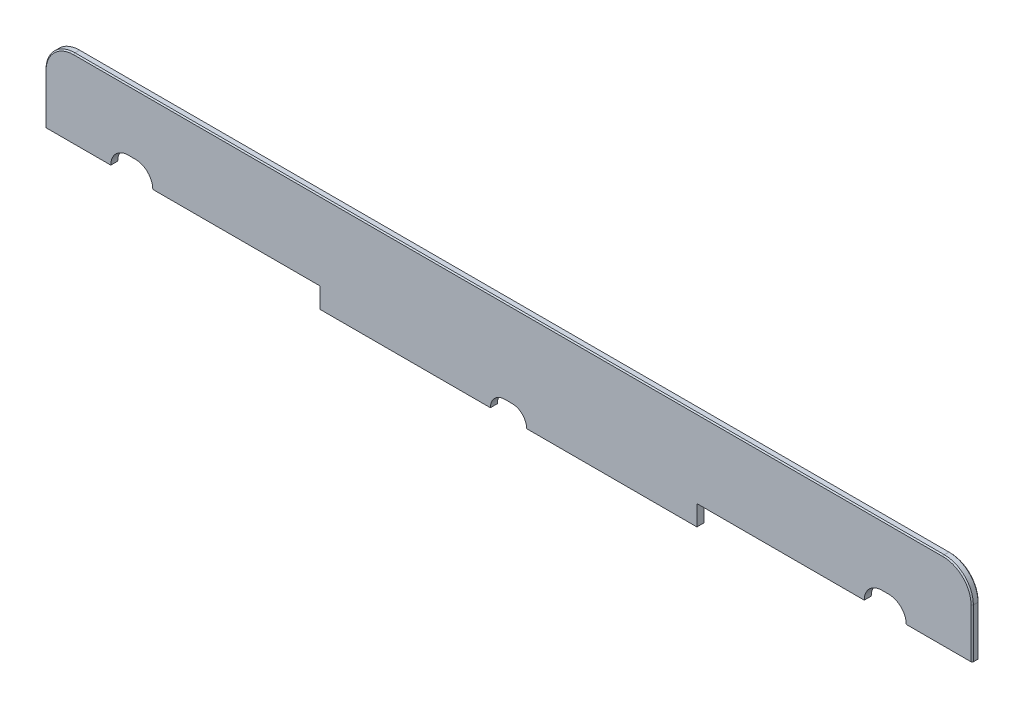
ISO-10303-21;
HEADER;
FILE_DESCRIPTION(('STEP AP214'),'2;1');
FILE_NAME('part.step','',(''),(''),'','','');
FILE_SCHEMA(('AUTOMOTIVE_DESIGN { 1 0 10303 214 1 1 1 1 }'));
ENDSEC;
DATA;
#1=APPLICATION_CONTEXT('core data for automotive mechanical design processes');
#2=APPLICATION_PROTOCOL_DEFINITION('international standard','automotive_design',2000,#1);
#3=PRODUCT_CONTEXT('',#1,'mechanical');
#4=PRODUCT('Part','Part','',(#3));
#5=PRODUCT_RELATED_PRODUCT_CATEGORY('part','',(#4));
#6=PRODUCT_DEFINITION_FORMATION('','',#4);
#7=PRODUCT_DEFINITION_CONTEXT('part definition',#1,'design');
#8=PRODUCT_DEFINITION('design','',#6,#7);
#9=PRODUCT_DEFINITION_SHAPE('','',#8);
#10=(LENGTH_UNIT() NAMED_UNIT(*) SI_UNIT(.MILLI.,.METRE.));
#11=(NAMED_UNIT(*) PLANE_ANGLE_UNIT() SI_UNIT($,.RADIAN.));
#12=(NAMED_UNIT(*) SI_UNIT($,.STERADIAN.) SOLID_ANGLE_UNIT());
#13=UNCERTAINTY_MEASURE_WITH_UNIT(LENGTH_MEASURE(1.E-05),#10,'distance_accuracy_value','');
#14=(GEOMETRIC_REPRESENTATION_CONTEXT(3) GLOBAL_UNCERTAINTY_ASSIGNED_CONTEXT((#13)) GLOBAL_UNIT_ASSIGNED_CONTEXT((#10,
#11,#12)) REPRESENTATION_CONTEXT('',''));
#15=CARTESIAN_POINT('',(0.,0.,0.));
#16=DIRECTION('',(0.,0.,1.));
#17=DIRECTION('',(1.,0.,0.));
#18=AXIS2_PLACEMENT_3D('',#15,#16,#17);
#19=CARTESIAN_POINT('',(-160.,0.,-0.01));
#20=DIRECTION('',(0.,-1.,0.));
#21=DIRECTION('',(0.,0.,-1.));
#22=AXIS2_PLACEMENT_3D('',#19,#20,#21);
#23=PLANE('',#22);
#24=DIRECTION('',(-1.,0.,0.));
#25=VECTOR('',#24,1.);
#26=CARTESIAN_POINT('',(0.,0.,0.));
#27=LINE('',#26,#25);
#28=CARTESIAN_POINT('',(-65.,0.,0.));
#29=VERTEX_POINT('',#28);
#30=CARTESIAN_POINT('',(-122.75,0.,0.));
#31=VERTEX_POINT('',#30);
#32=EDGE_CURVE('E244',#29,#31,#27,.T.);
#33=ORIENTED_EDGE('',*,*,#32,.F.);
#34=DIRECTION('',(0.,0.,1.));
#35=VECTOR('',#34,1.);
#36=CARTESIAN_POINT('',(-65.,0.,-0.01));
#37=LINE('',#36,#35);
#38=CARTESIAN_POINT('',(-65.,0.,2.4));
#39=VERTEX_POINT('',#38);
#40=EDGE_CURVE('E238',#29,#39,#37,.T.);
#41=ORIENTED_EDGE('',*,*,#40,.T.);
#42=DIRECTION('',(-1.,0.,0.));
#43=VECTOR('',#42,1.);
#44=CARTESIAN_POINT('',(0.,0.,2.4));
#45=LINE('',#44,#43);
#46=CARTESIAN_POINT('',(-122.75,0.,2.4));
#47=VERTEX_POINT('',#46);
#48=EDGE_CURVE('E241',#39,#47,#45,.T.);
#49=ORIENTED_EDGE('',*,*,#48,.T.);
#50=DIRECTION('',(0.,0.,-1.));
#51=VECTOR('',#50,1.);
#52=CARTESIAN_POINT('',(-122.75,0.,2.4));
#53=LINE('',#52,#51);
#54=EDGE_CURVE('E385',#31,#47,#53,.F.);
#55=ORIENTED_EDGE('',*,*,#54,.F.);
#56=EDGE_LOOP('',(#33,#41,#49,#55));
#57=FACE_BOUND('',#56,.T.);
#58=ADVANCED_FACE('F41',(#57),#23,.T.);
#59=CARTESIAN_POINT('',(-65.,-7.00000000000001,-0.01));
#60=DIRECTION('',(0.,-1.,0.));
#61=DIRECTION('',(1.,0.,0.));
#62=AXIS2_PLACEMENT_3D('',#59,#60,#61);
#63=PLANE('',#62);
#64=DIRECTION('',(-1.,0.,0.));
#65=VECTOR('',#64,1.);
#66=CARTESIAN_POINT('',(0.,-7.,0.));
#67=LINE('',#66,#65);
#68=CARTESIAN_POINT('',(-6.25,-7.,0.));
#69=VERTEX_POINT('',#68);
#70=CARTESIAN_POINT('',(-65.,-7.00000000000001,0.));
#71=VERTEX_POINT('',#70);
#72=EDGE_CURVE('E399',#69,#71,#67,.T.);
#73=ORIENTED_EDGE('',*,*,#72,.F.);
#74=DIRECTION('',(0.,0.,-1.));
#75=VECTOR('',#74,1.);
#76=CARTESIAN_POINT('',(-6.25,-7.,2.4));
#77=LINE('',#76,#75);
#78=CARTESIAN_POINT('',(-6.25,-7.,2.4));
#79=VERTEX_POINT('',#78);
#80=EDGE_CURVE('E377',#79,#69,#77,.T.);
#81=ORIENTED_EDGE('',*,*,#80,.F.);
#82=DIRECTION('',(-1.,0.,0.));
#83=VECTOR('',#82,1.);
#84=CARTESIAN_POINT('',(0.,-7.,2.4));
#85=LINE('',#84,#83);
#86=CARTESIAN_POINT('',(-65.,-7.00000000000001,2.4));
#87=VERTEX_POINT('',#86);
#88=EDGE_CURVE('E257',#79,#87,#85,.T.);
#89=ORIENTED_EDGE('',*,*,#88,.T.);
#90=DIRECTION('',(0.,0.,1.));
#91=VECTOR('',#90,1.);
#92=CARTESIAN_POINT('',(-65.,-7.00000000000001,-0.01));
#93=LINE('',#92,#91);
#94=EDGE_CURVE('E248',#71,#87,#93,.T.);
#95=ORIENTED_EDGE('',*,*,#94,.F.);
#96=EDGE_LOOP('',(#73,#81,#89,#95));
#97=FACE_BOUND('',#96,.T.);
#98=ADVANCED_FACE('F487',(#97),#63,.T.);
#99=CARTESIAN_POINT('',(-65.,0.,-0.01));
#100=DIRECTION('',(-1.,0.,0.));
#101=DIRECTION('',(0.,0.,1.));
#102=AXIS2_PLACEMENT_3D('',#99,#100,#101);
#103=PLANE('',#102);
#104=DIRECTION('',(0.,1.,0.));
#105=VECTOR('',#104,1.);
#106=CARTESIAN_POINT('',(-65.,0.,0.));
#107=LINE('',#106,#105);
#108=EDGE_CURVE('E401',#71,#29,#107,.T.);
#109=ORIENTED_EDGE('',*,*,#108,.F.);
#110=ORIENTED_EDGE('',*,*,#94,.T.);
#111=DIRECTION('',(0.,1.,0.));
#112=VECTOR('',#111,1.);
#113=CARTESIAN_POINT('',(-65.,0.,2.4));
#114=LINE('',#113,#112);
#115=EDGE_CURVE('E252',#87,#39,#114,.T.);
#116=ORIENTED_EDGE('',*,*,#115,.T.);
#117=ORIENTED_EDGE('',*,*,#40,.F.);
#118=EDGE_LOOP('',(#109,#110,#116,#117));
#119=FACE_BOUND('',#118,.T.);
#120=ADVANCED_FACE('F253',(#119),#103,.T.);
#121=CARTESIAN_POINT('',(65.,0.,-0.01));
#122=DIRECTION('',(0.,-1.,0.));
#123=DIRECTION('',(1.,0.,0.));
#124=AXIS2_PLACEMENT_3D('',#121,#122,#123);
#125=PLANE('',#124);
#126=DIRECTION('',(-1.,0.,0.));
#127=VECTOR('',#126,1.);
#128=CARTESIAN_POINT('',(0.,0.,0.));
#129=LINE('',#128,#127);
#130=CARTESIAN_POINT('',(122.75,0.,0.));
#131=VERTEX_POINT('',#130);
#132=CARTESIAN_POINT('',(65.,0.,0.));
#133=VERTEX_POINT('',#132);
#134=EDGE_CURVE('E395',#131,#133,#129,.T.);
#135=ORIENTED_EDGE('',*,*,#134,.F.);
#136=DIRECTION('',(0.,0.,-1.));
#137=VECTOR('',#136,1.);
#138=CARTESIAN_POINT('',(122.75,0.,2.4));
#139=LINE('',#138,#137);
#140=CARTESIAN_POINT('',(122.75,0.,2.4));
#141=VERTEX_POINT('',#140);
#142=EDGE_CURVE('E379',#141,#131,#139,.T.);
#143=ORIENTED_EDGE('',*,*,#142,.F.);
#144=DIRECTION('',(-1.,0.,0.));
#145=VECTOR('',#144,1.);
#146=CARTESIAN_POINT('',(0.,0.,2.4));
#147=LINE('',#146,#145);
#148=CARTESIAN_POINT('',(65.,0.,2.4));
#149=VERTEX_POINT('',#148);
#150=EDGE_CURVE('E272',#141,#149,#147,.T.);
#151=ORIENTED_EDGE('',*,*,#150,.T.);
#152=DIRECTION('',(0.,0.,1.));
#153=VECTOR('',#152,1.);
#154=CARTESIAN_POINT('',(65.,0.,-0.01));
#155=LINE('',#154,#153);
#156=EDGE_CURVE('E11',#133,#149,#155,.T.);
#157=ORIENTED_EDGE('',*,*,#156,.F.);
#158=EDGE_LOOP('',(#135,#143,#151,#157));
#159=FACE_BOUND('',#158,.T.);
#160=ADVANCED_FACE('F523',(#159),#125,.T.);
#161=DIRECTION('',(-1.,0.,0.));
#162=VECTOR('',#161,1.);
#163=CARTESIAN_POINT('',(0.,-7.,0.));
#164=LINE('',#163,#162);
#165=CARTESIAN_POINT('',(65.,-6.99999999999999,0.));
#166=VERTEX_POINT('',#165);
#167=CARTESIAN_POINT('',(6.25,-7.,0.));
#168=VERTEX_POINT('',#167);
#169=EDGE_CURVE('E390',#166,#168,#164,.T.);
#170=ORIENTED_EDGE('',*,*,#169,.F.);
#171=DIRECTION('',(0.,0.,1.));
#172=VECTOR('',#171,1.);
#173=CARTESIAN_POINT('',(65.,-6.99999999999999,-0.01));
#174=LINE('',#173,#172);
#175=CARTESIAN_POINT('',(65.,-6.99999999999999,2.4));
#176=VERTEX_POINT('',#175);
#177=EDGE_CURVE('E52',#166,#176,#174,.T.);
#178=ORIENTED_EDGE('',*,*,#177,.T.);
#179=DIRECTION('',(-1.,0.,0.));
#180=VECTOR('',#179,1.);
#181=CARTESIAN_POINT('',(0.,-7.,2.4));
#182=LINE('',#181,#180);
#183=CARTESIAN_POINT('',(6.25,-7.,2.4));
#184=VERTEX_POINT('',#183);
#185=EDGE_CURVE('E278',#176,#184,#182,.T.);
#186=ORIENTED_EDGE('',*,*,#185,.T.);
#187=DIRECTION('',(0.,0.,-1.));
#188=VECTOR('',#187,1.);
#189=CARTESIAN_POINT('',(6.25,-7.,2.4));
#190=LINE('',#189,#188);
#191=EDGE_CURVE('E375',#168,#184,#190,.F.);
#192=ORIENTED_EDGE('',*,*,#191,.F.);
#193=EDGE_LOOP('',(#170,#178,#186,#192));
#194=FACE_BOUND('',#193,.T.);
#195=ADVANCED_FACE('F524',(#194),#63,.T.);
#196=CARTESIAN_POINT('',(65.,-6.99999999999999,-0.01));
#197=DIRECTION('',(1.,0.,0.));
#198=DIRECTION('',(0.,0.,-1.));
#199=AXIS2_PLACEMENT_3D('',#196,#197,#198);
#200=PLANE('',#199);
#201=DIRECTION('',(0.,-1.,0.));
#202=VECTOR('',#201,1.);
#203=CARTESIAN_POINT('',(65.,0.,0.));
#204=LINE('',#203,#202);
#205=EDGE_CURVE('E392',#133,#166,#204,.T.);
#206=ORIENTED_EDGE('',*,*,#205,.F.);
#207=ORIENTED_EDGE('',*,*,#156,.T.);
#208=DIRECTION('',(0.,-1.,0.));
#209=VECTOR('',#208,1.);
#210=CARTESIAN_POINT('',(65.,0.,2.4));
#211=LINE('',#210,#209);
#212=EDGE_CURVE('E275',#149,#176,#211,.T.);
#213=ORIENTED_EDGE('',*,*,#212,.T.);
#214=ORIENTED_EDGE('',*,*,#177,.F.);
#215=EDGE_LOOP('',(#206,#207,#213,#214));
#216=FACE_BOUND('',#215,.T.);
#217=ADVANCED_FACE('F544',(#216),#200,.T.);
#218=DIRECTION('',(-0.707106781186583,0.,-0.707106781186512));
#219=VECTOR('',#218,1.);
#220=CARTESIAN_POINT('',(-159.6,0.,2.4));
#221=LINE('',#220,#219);
#222=CARTESIAN_POINT('',(-160.,0.,2.00000000000007));
#223=VERTEX_POINT('',#222);
#224=CARTESIAN_POINT('',(-159.6,0.,2.4));
#225=VERTEX_POINT('',#224);
#226=EDGE_CURVE('E372',#223,#225,#221,.F.);
#227=ORIENTED_EDGE('',*,*,#226,.F.);
#228=DIRECTION('',(0.,0.,-1.));
#229=VECTOR('',#228,1.);
#230=CARTESIAN_POINT('',(-160.,0.,2.4));
#231=LINE('',#230,#229);
#232=CARTESIAN_POINT('',(-160.,0.,0.400000000000039));
#233=VERTEX_POINT('',#232);
#234=EDGE_CURVE('E284',#223,#233,#231,.T.);
#235=ORIENTED_EDGE('',*,*,#234,.T.);
#236=DIRECTION('',(-0.707106781186534,0.,0.707106781186561));
#237=VECTOR('',#236,1.);
#238=CARTESIAN_POINT('',(-160.,0.,0.400000000000033));
#239=LINE('',#238,#237);
#240=CARTESIAN_POINT('',(-159.6,0.,0.));
#241=VERTEX_POINT('',#240);
#242=EDGE_CURVE('E368',#241,#233,#239,.T.);
#243=ORIENTED_EDGE('',*,*,#242,.F.);
#244=CARTESIAN_POINT('',(-137.25,0.,0.));
#245=VERTEX_POINT('',#244);
#246=EDGE_CURVE('E268',#245,#241,#27,.T.);
#247=ORIENTED_EDGE('',*,*,#246,.F.);
#248=DIRECTION('',(0.,0.,-1.));
#249=VECTOR('',#248,1.);
#250=CARTESIAN_POINT('',(-137.25,0.,2.4));
#251=LINE('',#250,#249);
#252=CARTESIAN_POINT('',(-137.25,0.,2.4));
#253=VERTEX_POINT('',#252);
#254=EDGE_CURVE('E383',#253,#245,#251,.T.);
#255=ORIENTED_EDGE('',*,*,#254,.F.);
#256=EDGE_CURVE('E263',#253,#225,#45,.T.);
#257=ORIENTED_EDGE('',*,*,#256,.T.);
#258=EDGE_LOOP('',(#227,#235,#243,#247,#255,#257));
#259=FACE_BOUND('',#258,.T.);
#260=ADVANCED_FACE('F520',(#259),#23,.T.);
#261=DIRECTION('',(-0.707106781186561,0.,0.707106781186534));
#262=VECTOR('',#261,1.);
#263=CARTESIAN_POINT('',(159.6,0.,2.4));
#264=LINE('',#263,#262);
#265=CARTESIAN_POINT('',(159.6,0.,2.4));
#266=VERTEX_POINT('',#265);
#267=CARTESIAN_POINT('',(160.,0.,2.00000000000007));
#268=VERTEX_POINT('',#267);
#269=EDGE_CURVE('E370',#266,#268,#264,.F.);
#270=ORIENTED_EDGE('',*,*,#269,.F.);
#271=DIRECTION('',(-1.,0.,0.));
#272=VECTOR('',#271,1.);
#273=CARTESIAN_POINT('',(0.,0.,2.4));
#274=LINE('',#273,#272);
#275=CARTESIAN_POINT('',(137.25,0.,2.4));
#276=VERTEX_POINT('',#275);
#277=EDGE_CURVE('E281',#266,#276,#274,.T.);
#278=ORIENTED_EDGE('',*,*,#277,.T.);
#279=DIRECTION('',(0.,0.,-1.));
#280=VECTOR('',#279,1.);
#281=CARTESIAN_POINT('',(137.25,0.,2.4));
#282=LINE('',#281,#280);
#283=CARTESIAN_POINT('',(137.25,0.,0.));
#284=VERTEX_POINT('',#283);
#285=EDGE_CURVE('E381',#284,#276,#282,.F.);
#286=ORIENTED_EDGE('',*,*,#285,.F.);
#287=DIRECTION('',(-1.,0.,0.));
#288=VECTOR('',#287,1.);
#289=CARTESIAN_POINT('',(0.,0.,0.));
#290=LINE('',#289,#288);
#291=CARTESIAN_POINT('',(159.6,0.,0.));
#292=VERTEX_POINT('',#291);
#293=EDGE_CURVE('E387',#292,#284,#290,.T.);
#294=ORIENTED_EDGE('',*,*,#293,.F.);
#295=DIRECTION('',(-0.707106781186512,0.,-0.707106781186583));
#296=VECTOR('',#295,1.);
#297=CARTESIAN_POINT('',(160.,0.,0.400000000000043));
#298=LINE('',#297,#296);
#299=CARTESIAN_POINT('',(160.,0.,0.400000000000039));
#300=VERTEX_POINT('',#299);
#301=EDGE_CURVE('E294',#300,#292,#298,.T.);
#302=ORIENTED_EDGE('',*,*,#301,.F.);
#303=DIRECTION('',(0.,0.,1.));
#304=VECTOR('',#303,1.);
#305=CARTESIAN_POINT('',(160.,0.,2.4));
#306=LINE('',#305,#304);
#307=EDGE_CURVE('E287',#300,#268,#306,.T.);
#308=ORIENTED_EDGE('',*,*,#307,.T.);
#309=EDGE_LOOP('',(#270,#278,#286,#294,#302,#308));
#310=FACE_BOUND('',#309,.T.);
#311=ADVANCED_FACE('F509',(#310),#125,.T.);
#312=CARTESIAN_POINT('',(160.,27.,2.4));
#313=DIRECTION('',(0.,-1.,0.));
#314=DIRECTION('',(1.,0.,0.));
#315=AXIS2_PLACEMENT_3D('',#312,#313,#314);
#316=PLANE('',#315);
#317=DIRECTION('',(0.,0.,-1.));
#318=VECTOR('',#317,1.);
#319=CARTESIAN_POINT('',(-150.,27.,2.4));
#320=LINE('',#319,#318);
#321=CARTESIAN_POINT('',(-150.,27.,0.400000000000039));
#322=VERTEX_POINT('',#321);
#323=CARTESIAN_POINT('',(-150.,27.,2.00000000000007));
#324=VERTEX_POINT('',#323);
#325=EDGE_CURVE('E459',#322,#324,#320,.F.);
#326=ORIENTED_EDGE('',*,*,#325,.T.);
#327=DIRECTION('',(1.,0.,0.));
#328=VECTOR('',#327,1.);
#329=CARTESIAN_POINT('',(160.,27.,2.00000000000007));
#330=LINE('',#329,#328);
#331=CARTESIAN_POINT('',(150.,27.,2.00000000000007));
#332=VERTEX_POINT('',#331);
#333=EDGE_CURVE('E440',#324,#332,#330,.T.);
#334=ORIENTED_EDGE('',*,*,#333,.T.);
#335=DIRECTION('',(0.,0.,-1.));
#336=VECTOR('',#335,1.);
#337=CARTESIAN_POINT('',(150.,27.,2.4));
#338=LINE('',#337,#336);
#339=CARTESIAN_POINT('',(150.,27.,0.400000000000039));
#340=VERTEX_POINT('',#339);
#341=EDGE_CURVE('E456',#332,#340,#338,.T.);
#342=ORIENTED_EDGE('',*,*,#341,.T.);
#343=DIRECTION('',(-1.,0.,0.));
#344=VECTOR('',#343,1.);
#345=CARTESIAN_POINT('',(-150.,27.,0.400000000000039));
#346=LINE('',#345,#344);
#347=EDGE_CURVE('E442',#340,#322,#346,.T.);
#348=ORIENTED_EDGE('',*,*,#347,.T.);
#349=EDGE_LOOP('',(#326,#334,#342,#348));
#350=FACE_BOUND('',#349,.T.);
#351=ADVANCED_FACE('F506',(#350),#316,.F.);
#352=CARTESIAN_POINT('',(0.,26.6000000000001,2.4));
#353=DIRECTION('',(0.,-0.707106781186524,-0.707106781186571));
#354=DIRECTION('',(-1.,0.,0.));
#355=AXIS2_PLACEMENT_3D('',#352,#353,#354);
#356=PLANE('',#355);
#357=DIRECTION('',(0.,-0.707106781186566,0.707106781186529));
#358=VECTOR('',#357,1.);
#359=CARTESIAN_POINT('',(-150.,27.,2.00000000000007));
#360=LINE('',#359,#358);
#361=CARTESIAN_POINT('',(-150.,26.6000000000001,2.4));
#362=VERTEX_POINT('',#361);
#363=EDGE_CURVE('E425',#324,#362,#360,.T.);
#364=ORIENTED_EDGE('',*,*,#363,.T.);
#365=DIRECTION('',(-1.,0.,0.));
#366=VECTOR('',#365,1.);
#367=CARTESIAN_POINT('',(0.,26.6000000000001,2.4));
#368=LINE('',#367,#366);
#369=CARTESIAN_POINT('',(150.,26.6000000000001,2.4));
#370=VERTEX_POINT('',#369);
#371=EDGE_CURVE('E448',#370,#362,#368,.T.);
#372=ORIENTED_EDGE('',*,*,#371,.F.);
#373=DIRECTION('',(0.,-0.707106781186572,0.707106781186523));
#374=VECTOR('',#373,1.);
#375=CARTESIAN_POINT('',(150.,27.,2.00000000000007));
#376=LINE('',#375,#374);
#377=EDGE_CURVE('E428',#332,#370,#376,.T.);
#378=ORIENTED_EDGE('',*,*,#377,.F.);
#379=ORIENTED_EDGE('',*,*,#333,.F.);
#380=EDGE_LOOP('',(#364,#372,#378,#379));
#381=FACE_BOUND('',#380,.T.);
#382=ADVANCED_FACE('F508',(#381),#356,.F.);
#383=CARTESIAN_POINT('',(160.,27.,0.400000000000039));
#384=DIRECTION('',(0.,0.707106781186574,-0.707106781186521));
#385=DIRECTION('',(1.,0.,0.));
#386=AXIS2_PLACEMENT_3D('',#383,#384,#385);
#387=PLANE('',#386);
#388=DIRECTION('',(0.,0.707106781186514,0.707106781186581));
#389=VECTOR('',#388,1.);
#390=CARTESIAN_POINT('',(-150.,26.6,0.));
#391=LINE('',#390,#389);
#392=CARTESIAN_POINT('',(-150.,26.6,0.));
#393=VERTEX_POINT('',#392);
#394=EDGE_CURVE('E414',#393,#322,#391,.T.);
#395=ORIENTED_EDGE('',*,*,#394,.T.);
#396=ORIENTED_EDGE('',*,*,#347,.F.);
#397=DIRECTION('',(0.,0.70710678118652,0.707106781186575));
#398=VECTOR('',#397,1.);
#399=CARTESIAN_POINT('',(150.,26.6,0.));
#400=LINE('',#399,#398);
#401=CARTESIAN_POINT('',(150.,26.6,0.));
#402=VERTEX_POINT('',#401);
#403=EDGE_CURVE('E418',#402,#340,#400,.T.);
#404=ORIENTED_EDGE('',*,*,#403,.F.);
#405=DIRECTION('',(1.,0.,0.));
#406=VECTOR('',#405,1.);
#407=CARTESIAN_POINT('',(150.,26.6,0.));
#408=LINE('',#407,#406);
#409=EDGE_CURVE('E434',#393,#402,#408,.T.);
#410=ORIENTED_EDGE('',*,*,#409,.F.);
#411=EDGE_LOOP('',(#395,#396,#404,#410));
#412=FACE_BOUND('',#411,.T.);
#413=ADVANCED_FACE('F517',(#412),#387,.T.);
#414=CARTESIAN_POINT('',(-150.,17.,2.4));
#415=DIRECTION('',(0.,0.,-1.));
#416=DIRECTION('',(-1.,0.,0.));
#417=AXIS2_PLACEMENT_3D('',#414,#415,#416);
#418=CYLINDRICAL_SURFACE('',#417,10.);
#419=DIRECTION('',(0.,0.,-1.));
#420=VECTOR('',#419,1.);
#421=CARTESIAN_POINT('',(-160.,17.,2.4));
#422=LINE('',#421,#420);
#423=CARTESIAN_POINT('',(-160.,17.,2.00000000000007));
#424=VERTEX_POINT('',#423);
#425=CARTESIAN_POINT('',(-160.,17.,0.400000000000039));
#426=VERTEX_POINT('',#425);
#427=EDGE_CURVE('E316',#424,#426,#422,.T.);
#428=ORIENTED_EDGE('',*,*,#427,.F.);
#429=CARTESIAN_POINT('',(-150.,17.,2.00000000000007));
#430=DIRECTION('',(0.,0.,-1.));
#431=DIRECTION('',(-1.,0.,0.));
#432=AXIS2_PLACEMENT_3D('',#429,#430,#431);
#433=CIRCLE('',#432,10.);
#434=EDGE_CURVE('E303',#424,#324,#433,.T.);
#435=ORIENTED_EDGE('',*,*,#434,.T.);
#436=ORIENTED_EDGE('',*,*,#325,.F.);
#437=CARTESIAN_POINT('',(-150.,17.,0.400000000000039));
#438=DIRECTION('',(0.,0.,-1.));
#439=DIRECTION('',(-1.,0.,0.));
#440=AXIS2_PLACEMENT_3D('',#437,#438,#439);
#441=CIRCLE('',#440,10.);
#442=EDGE_CURVE('E438',#322,#426,#441,.F.);
#443=ORIENTED_EDGE('',*,*,#442,.T.);
#444=EDGE_LOOP('',(#428,#435,#436,#443));
#445=FACE_BOUND('',#444,.T.);
#446=ADVANCED_FACE('F627',(#445),#418,.T.);
#447=CARTESIAN_POINT('',(150.,17.,2.4));
#448=DIRECTION('',(0.,0.,-1.));
#449=DIRECTION('',(-1.,0.,0.));
#450=AXIS2_PLACEMENT_3D('',#447,#448,#449);
#451=CYLINDRICAL_SURFACE('',#450,10.);
#452=ORIENTED_EDGE('',*,*,#341,.F.);
#453=CARTESIAN_POINT('',(150.,17.,2.00000000000007));
#454=DIRECTION('',(0.,0.,-1.));
#455=DIRECTION('',(-1.,0.,0.));
#456=AXIS2_PLACEMENT_3D('',#453,#454,#455);
#457=CIRCLE('',#456,10.);
#458=CARTESIAN_POINT('',(160.,17.,2.00000000000007));
#459=VERTEX_POINT('',#458);
#460=EDGE_CURVE('E444',#332,#459,#457,.T.);
#461=ORIENTED_EDGE('',*,*,#460,.T.);
#462=DIRECTION('',(0.,0.,-1.));
#463=VECTOR('',#462,1.);
#464=CARTESIAN_POINT('',(160.,17.,2.4));
#465=LINE('',#464,#463);
#466=CARTESIAN_POINT('',(160.,17.,0.400000000000039));
#467=VERTEX_POINT('',#466);
#468=EDGE_CURVE('E453',#467,#459,#465,.F.);
#469=ORIENTED_EDGE('',*,*,#468,.F.);
#470=CARTESIAN_POINT('',(150.,17.,0.400000000000039));
#471=DIRECTION('',(0.,0.,-1.));
#472=DIRECTION('',(-1.,0.,0.));
#473=AXIS2_PLACEMENT_3D('',#470,#471,#472);
#474=CIRCLE('',#473,10.);
#475=EDGE_CURVE('E308',#467,#340,#474,.F.);
#476=ORIENTED_EDGE('',*,*,#475,.T.);
#477=EDGE_LOOP('',(#452,#461,#469,#476));
#478=FACE_BOUND('',#477,.T.);
#479=ADVANCED_FACE('F527',(#478),#451,.T.);
#480=CARTESIAN_POINT('',(-128.75,6.00000000000005,2.4));
#481=DIRECTION('',(0.,-1.,0.));
#482=DIRECTION('',(0.,0.,-1.));
#483=AXIS2_PLACEMENT_3D('',#480,#481,#482);
#484=PLANE('',#483);
#485=DIRECTION('',(-1.,0.,0.));
#486=VECTOR('',#485,1.);
#487=CARTESIAN_POINT('',(-128.75,6.00000000000005,0.));
#488=LINE('',#487,#486);
#489=CARTESIAN_POINT('',(-128.75,6.00000000000005,0.));
#490=VERTEX_POINT('',#489);
#491=CARTESIAN_POINT('',(-131.25,6.00000000000005,0.));
#492=VERTEX_POINT('',#491);
#493=EDGE_CURVE('E327',#490,#492,#488,.T.);
#494=ORIENTED_EDGE('',*,*,#493,.F.);
#495=DIRECTION('',(0.,0.,-1.));
#496=VECTOR('',#495,1.);
#497=CARTESIAN_POINT('',(-128.75,6.00000000000005,2.4));
#498=LINE('',#497,#496);
#499=CARTESIAN_POINT('',(-128.75,6.00000000000005,2.4));
#500=VERTEX_POINT('',#499);
#501=EDGE_CURVE('E462',#500,#490,#498,.T.);
#502=ORIENTED_EDGE('',*,*,#501,.F.);
#503=DIRECTION('',(-1.,0.,0.));
#504=VECTOR('',#503,1.);
#505=CARTESIAN_POINT('',(-128.75,6.00000000000005,2.4));
#506=LINE('',#505,#504);
#507=CARTESIAN_POINT('',(-131.25,6.00000000000005,2.4));
#508=VERTEX_POINT('',#507);
#509=EDGE_CURVE('E321',#500,#508,#506,.T.);
#510=ORIENTED_EDGE('',*,*,#509,.T.);
#511=DIRECTION('',(0.,0.,-1.));
#512=VECTOR('',#511,1.);
#513=CARTESIAN_POINT('',(-131.25,6.00000000000005,2.4));
#514=LINE('',#513,#512);
#515=EDGE_CURVE('E322',#508,#492,#514,.T.);
#516=ORIENTED_EDGE('',*,*,#515,.T.);
#517=EDGE_LOOP('',(#494,#502,#510,#516));
#518=FACE_BOUND('',#517,.T.);
#519=ADVANCED_FACE('F529',(#518),#484,.T.);
#520=CARTESIAN_POINT('',(131.25,0.,2.4));
#521=DIRECTION('',(0.,0.,-1.));
#522=DIRECTION('',(-1.,0.,0.));
#523=AXIS2_PLACEMENT_3D('',#520,#521,#522);
#524=CYLINDRICAL_SURFACE('',#523,6.00000000000001);
#525=CARTESIAN_POINT('',(131.25,0.,0.));
#526=DIRECTION('',(0.,0.,1.));
#527=DIRECTION('',(1.,0.,0.));
#528=AXIS2_PLACEMENT_3D('',#525,#526,#527);
#529=CIRCLE('',#528,6.00000000000001);
#530=CARTESIAN_POINT('',(131.25,6.00000000000003,0.));
#531=VERTEX_POINT('',#530);
#532=EDGE_CURVE('E342',#284,#531,#529,.T.);
#533=ORIENTED_EDGE('',*,*,#532,.F.);
#534=ORIENTED_EDGE('',*,*,#285,.T.);
#535=CARTESIAN_POINT('',(131.25,0.,2.4));
#536=DIRECTION('',(0.,0.,1.));
#537=DIRECTION('',(1.,0.,0.));
#538=AXIS2_PLACEMENT_3D('',#535,#536,#537);
#539=CIRCLE('',#538,6.00000000000001);
#540=CARTESIAN_POINT('',(131.25,6.00000000000003,2.4));
#541=VERTEX_POINT('',#540);
#542=EDGE_CURVE('E336',#276,#541,#539,.T.);
#543=ORIENTED_EDGE('',*,*,#542,.T.);
#544=DIRECTION('',(0.,0.,-1.));
#545=VECTOR('',#544,1.);
#546=CARTESIAN_POINT('',(131.25,6.00000000000003,2.4));
#547=LINE('',#546,#545);
#548=EDGE_CURVE('E330',#541,#531,#547,.T.);
#549=ORIENTED_EDGE('',*,*,#548,.T.);
#550=EDGE_LOOP('',(#533,#534,#543,#549));
#551=FACE_BOUND('',#550,.T.);
#552=ADVANCED_FACE('F532',(#551),#524,.F.);
#553=CARTESIAN_POINT('',(-1.25,-7.,2.4));
#554=DIRECTION('',(0.,0.,-1.));
#555=DIRECTION('',(-1.,0.,0.));
#556=AXIS2_PLACEMENT_3D('',#553,#554,#555);
#557=CYLINDRICAL_SURFACE('',#556,5.);
#558=CARTESIAN_POINT('',(-1.25,-7.,2.4));
#559=DIRECTION('',(0.,0.,1.));
#560=DIRECTION('',(1.,0.,0.));
#561=AXIS2_PLACEMENT_3D('',#558,#559,#560);
#562=CIRCLE('',#561,5.);
#563=CARTESIAN_POINT('',(-1.25,-2.,2.4));
#564=VERTEX_POINT('',#563);
#565=EDGE_CURVE('E347',#564,#79,#562,.T.);
#566=ORIENTED_EDGE('',*,*,#565,.T.);
#567=ORIENTED_EDGE('',*,*,#80,.T.);
#568=CARTESIAN_POINT('',(-1.25,-7.,0.));
#569=DIRECTION('',(0.,0.,1.));
#570=DIRECTION('',(1.,0.,0.));
#571=AXIS2_PLACEMENT_3D('',#568,#569,#570);
#572=CIRCLE('',#571,5.);
#573=CARTESIAN_POINT('',(-1.25,-2.,0.));
#574=VERTEX_POINT('',#573);
#575=EDGE_CURVE('E46',#574,#69,#572,.T.);
#576=ORIENTED_EDGE('',*,*,#575,.F.);
#577=DIRECTION('',(0.,0.,-1.));
#578=VECTOR('',#577,1.);
#579=CARTESIAN_POINT('',(-1.25,-2.,2.4));
#580=LINE('',#579,#578);
#581=EDGE_CURVE('E360',#564,#574,#580,.T.);
#582=ORIENTED_EDGE('',*,*,#581,.F.);
#583=EDGE_LOOP('',(#566,#567,#576,#582));
#584=FACE_BOUND('',#583,.T.);
#585=ADVANCED_FACE('F484',(#584),#557,.F.);
#586=CARTESIAN_POINT('',(1.25,-7.,2.4));
#587=DIRECTION('',(0.,0.,-1.));
#588=DIRECTION('',(-1.,0.,0.));
#589=AXIS2_PLACEMENT_3D('',#586,#587,#588);
#590=CYLINDRICAL_SURFACE('',#589,5.);
#591=CARTESIAN_POINT('',(1.25,-7.,0.));
#592=DIRECTION('',(0.,0.,1.));
#593=DIRECTION('',(1.,0.,0.));
#594=AXIS2_PLACEMENT_3D('',#591,#592,#593);
#595=CIRCLE('',#594,5.);
#596=CARTESIAN_POINT('',(1.25,-2.,0.));
#597=VERTEX_POINT('',#596);
#598=EDGE_CURVE('E59',#168,#597,#595,.T.);
#599=ORIENTED_EDGE('',*,*,#598,.F.);
#600=ORIENTED_EDGE('',*,*,#191,.T.);
#601=CARTESIAN_POINT('',(1.25,-7.,2.4));
#602=DIRECTION('',(0.,0.,1.));
#603=DIRECTION('',(1.,0.,0.));
#604=AXIS2_PLACEMENT_3D('',#601,#602,#603);
#605=CIRCLE('',#604,5.);
#606=CARTESIAN_POINT('',(1.25,-2.,2.4));
#607=VERTEX_POINT('',#606);
#608=EDGE_CURVE('E345',#184,#607,#605,.T.);
#609=ORIENTED_EDGE('',*,*,#608,.T.);
#610=DIRECTION('',(0.,0.,-1.));
#611=VECTOR('',#610,1.);
#612=CARTESIAN_POINT('',(1.25,-2.,2.4));
#613=LINE('',#612,#611);
#614=EDGE_CURVE('E344',#607,#597,#613,.T.);
#615=ORIENTED_EDGE('',*,*,#614,.T.);
#616=EDGE_LOOP('',(#599,#600,#609,#615));
#617=FACE_BOUND('',#616,.T.);
#618=ADVANCED_FACE('F584',(#617),#590,.F.);
#619=CARTESIAN_POINT('',(-150.,17.,2.4));
#620=DIRECTION('',(0.,0.,-1.));
#621=DIRECTION('',(-1.,0.,0.));
#622=AXIS2_PLACEMENT_3D('',#619,#620,#621);
#623=CONICAL_SURFACE('',#622,9.60000000000005,0.785398163397472);
#624=DIRECTION('',(0.707106781186572,0.,0.707106781186523));
#625=VECTOR('',#624,1.);
#626=CARTESIAN_POINT('',(-160.,17.,2.00000000000007));
#627=LINE('',#626,#625);
#628=CARTESIAN_POINT('',(-159.6,17.,2.4));
#629=VERTEX_POINT('',#628);
#630=EDGE_CURVE('E353',#424,#629,#627,.T.);
#631=ORIENTED_EDGE('',*,*,#630,.T.);
#632=CARTESIAN_POINT('',(-150.,17.,2.4));
#633=DIRECTION('',(0.,0.,-1.));
#634=DIRECTION('',(-1.,0.,0.));
#635=AXIS2_PLACEMENT_3D('',#632,#633,#634);
#636=CIRCLE('',#635,9.60000000000005);
#637=EDGE_CURVE('E317',#362,#629,#636,.F.);
#638=ORIENTED_EDGE('',*,*,#637,.F.);
#639=ORIENTED_EDGE('',*,*,#363,.F.);
#640=ORIENTED_EDGE('',*,*,#434,.F.);
#641=EDGE_LOOP('',(#631,#638,#639,#640));
#642=FACE_BOUND('',#641,.T.);
#643=ADVANCED_FACE('F587',(#642),#623,.T.);
#644=CARTESIAN_POINT('',(150.,17.,2.4));
#645=DIRECTION('',(0.,0.,-1.));
#646=DIRECTION('',(-1.,0.,0.));
#647=AXIS2_PLACEMENT_3D('',#644,#645,#646);
#648=CONICAL_SURFACE('',#647,9.60000000000005,0.785398163397481);
#649=ORIENTED_EDGE('',*,*,#377,.T.);
#650=CARTESIAN_POINT('',(150.,17.,2.4));
#651=DIRECTION('',(0.,0.,-1.));
#652=DIRECTION('',(-1.,0.,0.));
#653=AXIS2_PLACEMENT_3D('',#650,#651,#652);
#654=CIRCLE('',#653,9.60000000000005);
#655=CARTESIAN_POINT('',(159.6,17.,2.4));
#656=VERTEX_POINT('',#655);
#657=EDGE_CURVE('E312',#656,#370,#654,.F.);
#658=ORIENTED_EDGE('',*,*,#657,.F.);
#659=DIRECTION('',(-0.707106781186572,0.,0.707106781186523));
#660=VECTOR('',#659,1.);
#661=CARTESIAN_POINT('',(160.,17.,2.00000000000007));
#662=LINE('',#661,#660);
#663=EDGE_CURVE('E415',#459,#656,#662,.T.);
#664=ORIENTED_EDGE('',*,*,#663,.F.);
#665=ORIENTED_EDGE('',*,*,#460,.F.);
#666=EDGE_LOOP('',(#649,#658,#664,#665));
#667=FACE_BOUND('',#666,.T.);
#668=ADVANCED_FACE('F610',(#667),#648,.T.);
#669=CARTESIAN_POINT('',(-150.,17.,0.));
#670=DIRECTION('',(0.,0.,1.));
#671=DIRECTION('',(1.,0.,0.));
#672=AXIS2_PLACEMENT_3D('',#669,#670,#671);
#673=CONICAL_SURFACE('',#672,9.6,0.785398163397403);
#674=DIRECTION('',(-0.707106781186548,0.,0.707106781186548));
#675=VECTOR('',#674,1.);
#676=CARTESIAN_POINT('',(-159.6,17.,0.));
#677=LINE('',#676,#675);
#678=CARTESIAN_POINT('',(-159.6,17.,0.));
#679=VERTEX_POINT('',#678);
#680=EDGE_CURVE('E411',#679,#426,#677,.T.);
#681=ORIENTED_EDGE('',*,*,#680,.T.);
#682=ORIENTED_EDGE('',*,*,#442,.F.);
#683=ORIENTED_EDGE('',*,*,#394,.F.);
#684=CARTESIAN_POINT('',(-150.,17.,0.));
#685=DIRECTION('',(0.,0.,-1.));
#686=DIRECTION('',(-1.,0.,0.));
#687=AXIS2_PLACEMENT_3D('',#684,#685,#686);
#688=CIRCLE('',#687,9.6);
#689=EDGE_CURVE('E298',#679,#393,#688,.T.);
#690=ORIENTED_EDGE('',*,*,#689,.F.);
#691=EDGE_LOOP('',(#681,#682,#683,#690));
#692=FACE_BOUND('',#691,.T.);
#693=ADVANCED_FACE('F604',(#692),#673,.T.);
#694=CARTESIAN_POINT('',(-160.,-23.,2.4));
#695=DIRECTION('',(1.,0.,0.));
#696=DIRECTION('',(0.,1.,0.));
#697=AXIS2_PLACEMENT_3D('',#694,#695,#696);
#698=PLANE('',#697);
#699=ORIENTED_EDGE('',*,*,#234,.F.);
#700=DIRECTION('',(0.,1.,0.));
#701=VECTOR('',#700,1.);
#702=CARTESIAN_POINT('',(-160.,-23.,2.00000000000007));
#703=LINE('',#702,#701);
#704=EDGE_CURVE('E297',#223,#424,#703,.T.);
#705=ORIENTED_EDGE('',*,*,#704,.T.);
#706=ORIENTED_EDGE('',*,*,#427,.T.);
#707=DIRECTION('',(0.,-1.,0.));
#708=VECTOR('',#707,1.);
#709=CARTESIAN_POINT('',(-160.,-13.,0.400000000000039));
#710=LINE('',#709,#708);
#711=EDGE_CURVE('E300',#426,#233,#710,.T.);
#712=ORIENTED_EDGE('',*,*,#711,.T.);
#713=EDGE_LOOP('',(#699,#705,#706,#712));
#714=FACE_BOUND('',#713,.T.);
#715=ADVANCED_FACE('F501',(#714),#698,.F.);
#716=CARTESIAN_POINT('',(150.,17.,0.));
#717=DIRECTION('',(0.,0.,1.));
#718=DIRECTION('',(1.,0.,0.));
#719=AXIS2_PLACEMENT_3D('',#716,#717,#718);
#720=CONICAL_SURFACE('',#719,9.59999999999999,0.785398163397412);
#721=ORIENTED_EDGE('',*,*,#403,.T.);
#722=ORIENTED_EDGE('',*,*,#475,.F.);
#723=DIRECTION('',(0.707106781186523,0.,0.707106781186572));
#724=VECTOR('',#723,1.);
#725=CARTESIAN_POINT('',(159.6,17.,0.));
#726=LINE('',#725,#724);
#727=CARTESIAN_POINT('',(159.6,17.,0.));
#728=VERTEX_POINT('',#727);
#729=EDGE_CURVE('E249',#728,#467,#726,.T.);
#730=ORIENTED_EDGE('',*,*,#729,.F.);
#731=CARTESIAN_POINT('',(150.,17.,0.));
#732=DIRECTION('',(0.,0.,-1.));
#733=DIRECTION('',(-1.,0.,0.));
#734=AXIS2_PLACEMENT_3D('',#731,#732,#733);
#735=CIRCLE('',#734,9.6);
#736=EDGE_CURVE('E293',#402,#728,#735,.T.);
#737=ORIENTED_EDGE('',*,*,#736,.F.);
#738=EDGE_LOOP('',(#721,#722,#730,#737));
#739=FACE_BOUND('',#738,.T.);
#740=ADVANCED_FACE('F492',(#739),#720,.T.);
#741=CARTESIAN_POINT('',(0.,0.,0.));
#742=DIRECTION('',(0.,0.,-1.));
#743=DIRECTION('',(-1.,0.,0.));
#744=AXIS2_PLACEMENT_3D('',#741,#742,#743);
#745=PLANE('',#744);
#746=DIRECTION('',(-1.,0.,0.));
#747=VECTOR('',#746,1.);
#748=CARTESIAN_POINT('',(-1.25,-2.,0.));
#749=LINE('',#748,#747);
#750=CARTESIAN_POINT('',(0.,-2.,0.));
#751=VERTEX_POINT('',#750);
#752=EDGE_CURVE('E351',#751,#574,#749,.T.);
#753=ORIENTED_EDGE('',*,*,#752,.T.);
#754=ORIENTED_EDGE('',*,*,#575,.T.);
#755=ORIENTED_EDGE('',*,*,#72,.T.);
#756=ORIENTED_EDGE('',*,*,#108,.T.);
#757=ORIENTED_EDGE('',*,*,#32,.T.);
#758=CARTESIAN_POINT('',(-128.75,0.,0.));
#759=DIRECTION('',(0.,0.,1.));
#760=DIRECTION('',(1.,0.,0.));
#761=AXIS2_PLACEMENT_3D('',#758,#759,#760);
#762=CIRCLE('',#761,6.00000000000005);
#763=EDGE_CURVE('E328',#31,#490,#762,.T.);
#764=ORIENTED_EDGE('',*,*,#763,.T.);
#765=ORIENTED_EDGE('',*,*,#493,.T.);
#766=CARTESIAN_POINT('',(-131.25,0.,0.));
#767=DIRECTION('',(0.,0.,1.));
#768=DIRECTION('',(1.,0.,0.));
#769=AXIS2_PLACEMENT_3D('',#766,#767,#768);
#770=CIRCLE('',#769,6.00000000000005);
#771=EDGE_CURVE('E324',#492,#245,#770,.T.);
#772=ORIENTED_EDGE('',*,*,#771,.T.);
#773=ORIENTED_EDGE('',*,*,#246,.T.);
#774=DIRECTION('',(0.,1.,0.));
#775=VECTOR('',#774,1.);
#776=CARTESIAN_POINT('',(-159.6,17.,0.));
#777=LINE('',#776,#775);
#778=EDGE_CURVE('E295',#241,#679,#777,.T.);
#779=ORIENTED_EDGE('',*,*,#778,.T.);
#780=ORIENTED_EDGE('',*,*,#689,.T.);
#781=ORIENTED_EDGE('',*,*,#409,.T.);
#782=ORIENTED_EDGE('',*,*,#736,.T.);
#783=DIRECTION('',(0.,-1.,0.));
#784=VECTOR('',#783,1.);
#785=CARTESIAN_POINT('',(159.6,-13.,0.));
#786=LINE('',#785,#784);
#787=EDGE_CURVE('E290',#728,#292,#786,.T.);
#788=ORIENTED_EDGE('',*,*,#787,.T.);
#789=ORIENTED_EDGE('',*,*,#293,.T.);
#790=ORIENTED_EDGE('',*,*,#532,.T.);
#791=DIRECTION('',(-1.,0.,0.));
#792=VECTOR('',#791,1.);
#793=CARTESIAN_POINT('',(131.25,6.00000000000003,0.));
#794=LINE('',#793,#792);
#795=CARTESIAN_POINT('',(128.75,6.00000000000002,0.));
#796=VERTEX_POINT('',#795);
#797=EDGE_CURVE('E341',#531,#796,#794,.T.);
#798=ORIENTED_EDGE('',*,*,#797,.T.);
#799=CARTESIAN_POINT('',(128.75,0.,0.));
#800=DIRECTION('',(0.,0.,1.));
#801=DIRECTION('',(1.,0.,0.));
#802=AXIS2_PLACEMENT_3D('',#799,#800,#801);
#803=CIRCLE('',#802,6.00000000000001);
#804=EDGE_CURVE('E338',#796,#131,#803,.T.);
#805=ORIENTED_EDGE('',*,*,#804,.T.);
#806=ORIENTED_EDGE('',*,*,#134,.T.);
#807=ORIENTED_EDGE('',*,*,#205,.T.);
#808=ORIENTED_EDGE('',*,*,#169,.T.);
#809=ORIENTED_EDGE('',*,*,#598,.T.);
#810=EDGE_CURVE('E350',#597,#751,#749,.T.);
#811=ORIENTED_EDGE('',*,*,#810,.T.);
#812=EDGE_LOOP('',(#753,#754,#755,#756,#757,#764,#765,#772,#773,#779,#780,#781,#782,#788,#789,
#790,#798,#805,#806,#807,#808,#809,#811));
#813=FACE_BOUND('',#812,.T.);
#814=ADVANCED_FACE('F488',(#813),#745,.T.);
#815=CARTESIAN_POINT('',(160.,-23.,2.4));
#816=DIRECTION('',(-1.,0.,0.));
#817=DIRECTION('',(0.,-1.,0.));
#818=AXIS2_PLACEMENT_3D('',#815,#816,#817);
#819=PLANE('',#818);
#820=ORIENTED_EDGE('',*,*,#307,.F.);
#821=DIRECTION('',(0.,1.,0.));
#822=VECTOR('',#821,1.);
#823=CARTESIAN_POINT('',(160.,17.,0.400000000000039));
#824=LINE('',#823,#822);
#825=EDGE_CURVE('E307',#300,#467,#824,.T.);
#826=ORIENTED_EDGE('',*,*,#825,.T.);
#827=ORIENTED_EDGE('',*,*,#468,.T.);
#828=DIRECTION('',(0.,-1.,0.));
#829=VECTOR('',#828,1.);
#830=CARTESIAN_POINT('',(160.,-23.,2.00000000000007));
#831=LINE('',#830,#829);
#832=EDGE_CURVE('E304',#459,#268,#831,.T.);
#833=ORIENTED_EDGE('',*,*,#832,.T.);
#834=EDGE_LOOP('',(#820,#826,#827,#833));
#835=FACE_BOUND('',#834,.T.);
#836=ADVANCED_FACE('F491',(#835),#819,.F.);
#837=CARTESIAN_POINT('',(160.,-23.,0.400000000000039));
#838=DIRECTION('',(0.707106781186583,0.,-0.707106781186512));
#839=DIRECTION('',(0.,-1.,0.));
#840=AXIS2_PLACEMENT_3D('',#837,#838,#839);
#841=PLANE('',#840);
#842=ORIENTED_EDGE('',*,*,#825,.F.);
#843=ORIENTED_EDGE('',*,*,#301,.T.);
#844=ORIENTED_EDGE('',*,*,#787,.F.);
#845=ORIENTED_EDGE('',*,*,#729,.T.);
#846=EDGE_LOOP('',(#842,#843,#844,#845));
#847=FACE_BOUND('',#846,.T.);
#848=ADVANCED_FACE('F44',(#847),#841,.T.);
#849=CARTESIAN_POINT('',(-160.,-23.,0.400000000000039));
#850=DIRECTION('',(-0.707106781186561,0.,-0.707106781186534));
#851=DIRECTION('',(0.,1.,0.));
#852=AXIS2_PLACEMENT_3D('',#849,#850,#851);
#853=PLANE('',#852);
#854=ORIENTED_EDGE('',*,*,#778,.F.);
#855=ORIENTED_EDGE('',*,*,#242,.T.);
#856=ORIENTED_EDGE('',*,*,#711,.F.);
#857=ORIENTED_EDGE('',*,*,#680,.F.);
#858=EDGE_LOOP('',(#854,#855,#856,#857));
#859=FACE_BOUND('',#858,.T.);
#860=ADVANCED_FACE('F555',(#859),#853,.T.);
#861=CARTESIAN_POINT('',(0.,0.,2.4));
#862=DIRECTION('',(0.,0.,-1.));
#863=DIRECTION('',(-1.,0.,0.));
#864=AXIS2_PLACEMENT_3D('',#861,#862,#863);
#865=PLANE('',#864);
#866=DIRECTION('',(-1.,0.,0.));
#867=VECTOR('',#866,1.);
#868=CARTESIAN_POINT('',(-1.25,-2.,2.4));
#869=LINE('',#868,#867);
#870=CARTESIAN_POINT('',(0.,-2.,2.4));
#871=VERTEX_POINT('',#870);
#872=EDGE_CURVE('E362',#607,#871,#869,.T.);
#873=ORIENTED_EDGE('',*,*,#872,.F.);
#874=ORIENTED_EDGE('',*,*,#608,.F.);
#875=ORIENTED_EDGE('',*,*,#185,.F.);
#876=ORIENTED_EDGE('',*,*,#212,.F.);
#877=ORIENTED_EDGE('',*,*,#150,.F.);
#878=CARTESIAN_POINT('',(128.75,0.,2.4));
#879=DIRECTION('',(0.,0.,1.));
#880=DIRECTION('',(1.,0.,0.));
#881=AXIS2_PLACEMENT_3D('',#878,#879,#880);
#882=CIRCLE('',#881,6.00000000000001);
#883=CARTESIAN_POINT('',(128.75,6.00000000000002,2.4));
#884=VERTEX_POINT('',#883);
#885=EDGE_CURVE('E331',#884,#141,#882,.T.);
#886=ORIENTED_EDGE('',*,*,#885,.F.);
#887=DIRECTION('',(-1.,0.,0.));
#888=VECTOR('',#887,1.);
#889=CARTESIAN_POINT('',(131.25,6.00000000000003,2.4));
#890=LINE('',#889,#888);
#891=EDGE_CURVE('E334',#541,#884,#890,.T.);
#892=ORIENTED_EDGE('',*,*,#891,.F.);
#893=ORIENTED_EDGE('',*,*,#542,.F.);
#894=ORIENTED_EDGE('',*,*,#277,.F.);
#895=DIRECTION('',(0.,1.,0.));
#896=VECTOR('',#895,1.);
#897=CARTESIAN_POINT('',(159.6,0.,2.4));
#898=LINE('',#897,#896);
#899=EDGE_CURVE('E310',#266,#656,#898,.T.);
#900=ORIENTED_EDGE('',*,*,#899,.T.);
#901=ORIENTED_EDGE('',*,*,#657,.T.);
#902=ORIENTED_EDGE('',*,*,#371,.T.);
#903=ORIENTED_EDGE('',*,*,#637,.T.);
#904=DIRECTION('',(0.,-1.,0.));
#905=VECTOR('',#904,1.);
#906=CARTESIAN_POINT('',(-159.6,0.,2.4));
#907=LINE('',#906,#905);
#908=EDGE_CURVE('E313',#629,#225,#907,.T.);
#909=ORIENTED_EDGE('',*,*,#908,.T.);
#910=ORIENTED_EDGE('',*,*,#256,.F.);
#911=CARTESIAN_POINT('',(-131.25,0.,2.4));
#912=DIRECTION('',(0.,0.,1.));
#913=DIRECTION('',(1.,0.,0.));
#914=AXIS2_PLACEMENT_3D('',#911,#912,#913);
#915=CIRCLE('',#914,6.00000000000005);
#916=EDGE_CURVE('E318',#508,#253,#915,.T.);
#917=ORIENTED_EDGE('',*,*,#916,.F.);
#918=ORIENTED_EDGE('',*,*,#509,.F.);
#919=CARTESIAN_POINT('',(-128.75,0.,2.4));
#920=DIRECTION('',(0.,0.,1.));
#921=DIRECTION('',(1.,0.,0.));
#922=AXIS2_PLACEMENT_3D('',#919,#920,#921);
#923=CIRCLE('',#922,6.00000000000005);
#924=EDGE_CURVE('E262',#47,#500,#923,.T.);
#925=ORIENTED_EDGE('',*,*,#924,.F.);
#926=ORIENTED_EDGE('',*,*,#48,.F.);
#927=ORIENTED_EDGE('',*,*,#115,.F.);
#928=ORIENTED_EDGE('',*,*,#88,.F.);
#929=ORIENTED_EDGE('',*,*,#565,.F.);
#930=EDGE_CURVE('E348',#871,#564,#869,.T.);
#931=ORIENTED_EDGE('',*,*,#930,.F.);
#932=EDGE_LOOP('',(#873,#874,#875,#876,#877,#886,#892,#893,#894,#900,#901,#902,#903,#909,#910,
#917,#918,#925,#926,#927,#928,#929,#931));
#933=FACE_BOUND('',#932,.T.);
#934=ADVANCED_FACE('F260',(#933),#865,.F.);
#935=CARTESIAN_POINT('',(159.6,0.,2.4));
#936=DIRECTION('',(-0.707106781186534,0.,-0.707106781186561));
#937=DIRECTION('',(0.,1.,0.));
#938=AXIS2_PLACEMENT_3D('',#935,#936,#937);
#939=PLANE('',#938);
#940=ORIENTED_EDGE('',*,*,#899,.F.);
#941=ORIENTED_EDGE('',*,*,#269,.T.);
#942=ORIENTED_EDGE('',*,*,#832,.F.);
#943=ORIENTED_EDGE('',*,*,#663,.T.);
#944=EDGE_LOOP('',(#940,#941,#942,#943));
#945=FACE_BOUND('',#944,.T.);
#946=ADVANCED_FACE('F554',(#945),#939,.F.);
#947=CARTESIAN_POINT('',(-159.6,0.,2.4));
#948=DIRECTION('',(0.707106781186512,0.,-0.707106781186583));
#949=DIRECTION('',(0.,-1.,0.));
#950=AXIS2_PLACEMENT_3D('',#947,#948,#949);
#951=PLANE('',#950);
#952=ORIENTED_EDGE('',*,*,#704,.F.);
#953=ORIENTED_EDGE('',*,*,#226,.T.);
#954=ORIENTED_EDGE('',*,*,#908,.F.);
#955=ORIENTED_EDGE('',*,*,#630,.F.);
#956=EDGE_LOOP('',(#952,#953,#954,#955));
#957=FACE_BOUND('',#956,.T.);
#958=ADVANCED_FACE('F561',(#957),#951,.F.);
#959=CARTESIAN_POINT('',(-1.25,-2.,2.4));
#960=DIRECTION('',(0.,-1.,0.));
#961=DIRECTION('',(1.,0.,0.));
#962=AXIS2_PLACEMENT_3D('',#959,#960,#961);
#963=PLANE('',#962);
#964=ORIENTED_EDGE('',*,*,#872,.T.);
#965=DIRECTION('',(0.,0.,-1.));
#966=VECTOR('',#965,1.);
#967=CARTESIAN_POINT('',(0.,-2.,2.4));
#968=LINE('',#967,#966);
#969=EDGE_CURVE('E374',#871,#751,#968,.T.);
#970=ORIENTED_EDGE('',*,*,#969,.T.);
#971=ORIENTED_EDGE('',*,*,#810,.F.);
#972=ORIENTED_EDGE('',*,*,#614,.F.);
#973=EDGE_LOOP('',(#964,#970,#971,#972));
#974=FACE_BOUND('',#973,.T.);
#975=ADVANCED_FACE('F540',(#974),#963,.T.);
#976=ORIENTED_EDGE('',*,*,#969,.F.);
#977=ORIENTED_EDGE('',*,*,#930,.T.);
#978=ORIENTED_EDGE('',*,*,#581,.T.);
#979=ORIENTED_EDGE('',*,*,#752,.F.);
#980=EDGE_LOOP('',(#976,#977,#978,#979));
#981=FACE_BOUND('',#980,.T.);
#982=ADVANCED_FACE('F481',(#981),#963,.T.);
#983=CARTESIAN_POINT('',(131.25,6.00000000000003,2.4));
#984=DIRECTION('',(0.,-1.,0.));
#985=DIRECTION('',(0.,0.,-1.));
#986=AXIS2_PLACEMENT_3D('',#983,#984,#985);
#987=PLANE('',#986);
#988=ORIENTED_EDGE('',*,*,#797,.F.);
#989=ORIENTED_EDGE('',*,*,#548,.F.);
#990=ORIENTED_EDGE('',*,*,#891,.T.);
#991=DIRECTION('',(0.,0.,-1.));
#992=VECTOR('',#991,1.);
#993=CARTESIAN_POINT('',(128.75,6.00000000000002,2.4));
#994=LINE('',#993,#992);
#995=EDGE_CURVE('E335',#884,#796,#994,.T.);
#996=ORIENTED_EDGE('',*,*,#995,.T.);
#997=EDGE_LOOP('',(#988,#989,#990,#996));
#998=FACE_BOUND('',#997,.T.);
#999=ADVANCED_FACE('F534',(#998),#987,.T.);
#1000=CARTESIAN_POINT('',(128.75,0.,2.4));
#1001=DIRECTION('',(0.,0.,-1.));
#1002=DIRECTION('',(-1.,0.,0.));
#1003=AXIS2_PLACEMENT_3D('',#1000,#1001,#1002);
#1004=CYLINDRICAL_SURFACE('',#1003,6.00000000000001);
#1005=ORIENTED_EDGE('',*,*,#885,.T.);
#1006=ORIENTED_EDGE('',*,*,#142,.T.);
#1007=ORIENTED_EDGE('',*,*,#804,.F.);
#1008=ORIENTED_EDGE('',*,*,#995,.F.);
#1009=EDGE_LOOP('',(#1005,#1006,#1007,#1008));
#1010=FACE_BOUND('',#1009,.T.);
#1011=ADVANCED_FACE('F537',(#1010),#1004,.F.);
#1012=CARTESIAN_POINT('',(-131.25,0.,2.4));
#1013=DIRECTION('',(0.,0.,-1.));
#1014=DIRECTION('',(-1.,0.,0.));
#1015=AXIS2_PLACEMENT_3D('',#1012,#1013,#1014);
#1016=CYLINDRICAL_SURFACE('',#1015,6.00000000000005);
#1017=ORIENTED_EDGE('',*,*,#916,.T.);
#1018=ORIENTED_EDGE('',*,*,#254,.T.);
#1019=ORIENTED_EDGE('',*,*,#771,.F.);
#1020=ORIENTED_EDGE('',*,*,#515,.F.);
#1021=EDGE_LOOP('',(#1017,#1018,#1019,#1020));
#1022=FACE_BOUND('',#1021,.T.);
#1023=ADVANCED_FACE('F592',(#1022),#1016,.F.);
#1024=CARTESIAN_POINT('',(-128.75,0.,2.4));
#1025=DIRECTION('',(0.,0.,-1.));
#1026=DIRECTION('',(-1.,0.,0.));
#1027=AXIS2_PLACEMENT_3D('',#1024,#1025,#1026);
#1028=CYLINDRICAL_SURFACE('',#1027,6.00000000000005);
#1029=ORIENTED_EDGE('',*,*,#763,.F.);
#1030=ORIENTED_EDGE('',*,*,#54,.T.);
#1031=ORIENTED_EDGE('',*,*,#924,.T.);
#1032=ORIENTED_EDGE('',*,*,#501,.T.);
#1033=EDGE_LOOP('',(#1029,#1030,#1031,#1032));
#1034=FACE_BOUND('',#1033,.T.);
#1035=ADVANCED_FACE('F599',(#1034),#1028,.F.);
#1036=CLOSED_SHELL('',(#58,#98,#120,#160,#195,#217,#260,#311,#351,#382,#413,#446,#479,#519,#552,
#585,#618,#643,#668,#693,#715,#740,#814,#836,#848,#860,#934,#946,#958,#975,#982,#999,#1011,
#1023,#1035));
#1037=MANIFOLD_SOLID_BREP('B2',#1036);
#1038=ADVANCED_BREP_SHAPE_REPRESENTATION('',(#18,#1037),#14);
#1039=SHAPE_DEFINITION_REPRESENTATION(#9,#1038);
ENDSEC;
END-ISO-10303-21;
